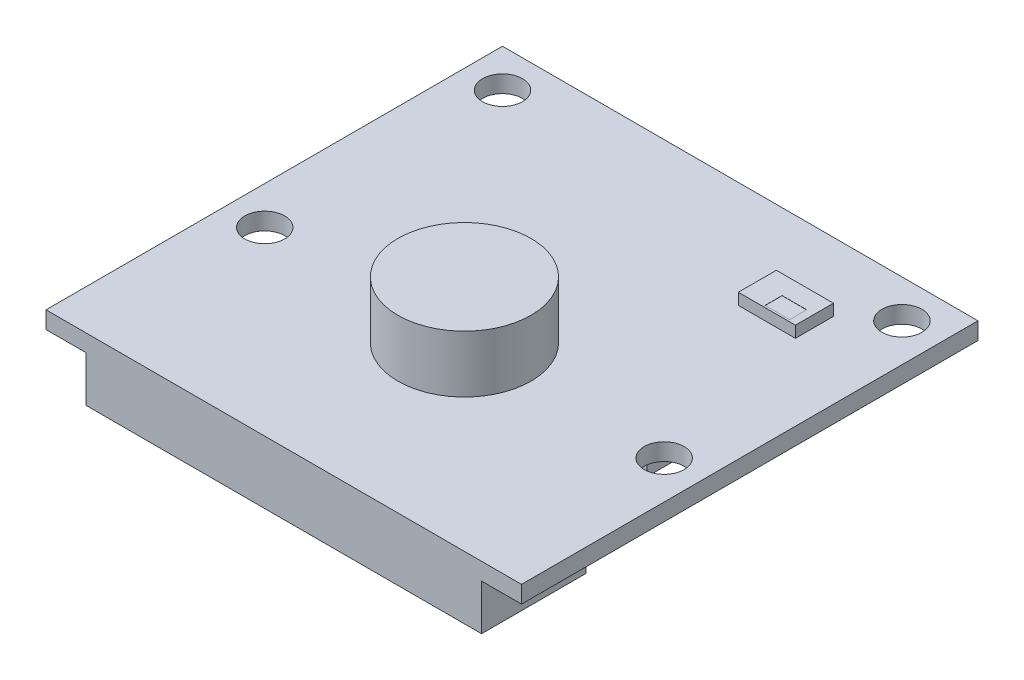
ISO-10303-21;
HEADER;
FILE_DESCRIPTION(('STEP AP214'),'2;1');
FILE_NAME('part.step','',(''),(''),'','','');
FILE_SCHEMA(('AUTOMOTIVE_DESIGN { 1 0 10303 214 1 1 1 1 }'));
ENDSEC;
DATA;
#1=APPLICATION_CONTEXT('core data for automotive mechanical design processes');
#2=APPLICATION_PROTOCOL_DEFINITION('international standard','automotive_design',2000,#1);
#3=PRODUCT_CONTEXT('',#1,'mechanical');
#4=PRODUCT('Part','Part','',(#3));
#5=PRODUCT_RELATED_PRODUCT_CATEGORY('part','',(#4));
#6=PRODUCT_DEFINITION_FORMATION('','',#4);
#7=PRODUCT_DEFINITION_CONTEXT('part definition',#1,'design');
#8=PRODUCT_DEFINITION('design','',#6,#7);
#9=PRODUCT_DEFINITION_SHAPE('','',#8);
#10=(LENGTH_UNIT() NAMED_UNIT(*) SI_UNIT(.MILLI.,.METRE.));
#11=(NAMED_UNIT(*) PLANE_ANGLE_UNIT() SI_UNIT($,.RADIAN.));
#12=(NAMED_UNIT(*) SI_UNIT($,.STERADIAN.) SOLID_ANGLE_UNIT());
#13=UNCERTAINTY_MEASURE_WITH_UNIT(LENGTH_MEASURE(1.E-05),#10,'distance_accuracy_value','');
#14=(GEOMETRIC_REPRESENTATION_CONTEXT(3) GLOBAL_UNCERTAINTY_ASSIGNED_CONTEXT((#13)) GLOBAL_UNIT_ASSIGNED_CONTEXT((#10,
#11,#12)) REPRESENTATION_CONTEXT('',''));
#15=CARTESIAN_POINT('',(0.,0.,0.));
#16=DIRECTION('',(0.,0.,1.));
#17=DIRECTION('',(1.,0.,0.));
#18=AXIS2_PLACEMENT_3D('',#15,#16,#17);
#19=CARTESIAN_POINT('',(0.,0.,0.));
#20=DIRECTION('',(0.,1.,0.));
#21=DIRECTION('',(0.,0.,1.));
#22=AXIS2_PLACEMENT_3D('',#19,#20,#21);
#23=PLANE('',#22);
#24=DIRECTION('',(1.,0.,0.));
#25=VECTOR('',#24,1.);
#26=CARTESIAN_POINT('',(5.5,0.,-8.90000000000001));
#27=LINE('',#26,#25);
#28=CARTESIAN_POINT('',(5.5,0.,-8.90000000000001));
#29=VERTEX_POINT('',#28);
#30=CARTESIAN_POINT('',(8.5,0.,-8.90000000000001));
#31=VERTEX_POINT('',#30);
#32=EDGE_CURVE('E227',#29,#31,#27,.T.);
#33=ORIENTED_EDGE('',*,*,#32,.F.);
#34=DIRECTION('',(0.,0.,1.));
#35=VECTOR('',#34,1.);
#36=CARTESIAN_POINT('',(5.5,0.,-10.9));
#37=LINE('',#36,#35);
#38=CARTESIAN_POINT('',(5.5,0.,-10.9));
#39=VERTEX_POINT('',#38);
#40=EDGE_CURVE('E210',#39,#29,#37,.T.);
#41=ORIENTED_EDGE('',*,*,#40,.F.);
#42=DIRECTION('',(-1.,0.,0.));
#43=VECTOR('',#42,1.);
#44=CARTESIAN_POINT('',(5.5,0.,-10.9));
#45=LINE('',#44,#43);
#46=CARTESIAN_POINT('',(8.5,0.,-10.9));
#47=VERTEX_POINT('',#46);
#48=EDGE_CURVE('E218',#47,#39,#45,.T.);
#49=ORIENTED_EDGE('',*,*,#48,.F.);
#50=DIRECTION('',(0.,0.,-1.));
#51=VECTOR('',#50,1.);
#52=CARTESIAN_POINT('',(8.5,0.,-10.9));
#53=LINE('',#52,#51);
#54=EDGE_CURVE('E229',#31,#47,#53,.T.);
#55=ORIENTED_EDGE('',*,*,#54,.F.);
#56=EDGE_LOOP('',(#33,#41,#49,#55));
#57=FACE_BOUND('',#56,.T.);
#58=CARTESIAN_POINT('',(-10.5,0.,-12.5));
#59=DIRECTION('',(0.,1.,0.));
#60=DIRECTION('',(0.,0.,-1.));
#61=AXIS2_PLACEMENT_3D('',#58,#59,#60);
#62=CIRCLE('',#61,1.05);
#63=CARTESIAN_POINT('',(-10.5,0.,-13.55));
#64=VERTEX_POINT('',#63);
#65=EDGE_CURVE('E377',#64,#64,#62,.T.);
#66=ORIENTED_EDGE('',*,*,#65,.F.);
#67=EDGE_LOOP('',(#66));
#68=FACE_BOUND('',#67,.T.);
#69=CARTESIAN_POINT('',(-10.5,0.,0.));
#70=DIRECTION('',(0.,1.,0.));
#71=DIRECTION('',(0.,0.,-1.));
#72=AXIS2_PLACEMENT_3D('',#69,#70,#71);
#73=CIRCLE('',#72,1.05);
#74=CARTESIAN_POINT('',(-10.5,0.,-1.05));
#75=VERTEX_POINT('',#74);
#76=EDGE_CURVE('E383',#75,#75,#73,.T.);
#77=ORIENTED_EDGE('',*,*,#76,.F.);
#78=EDGE_LOOP('',(#77));
#79=FACE_BOUND('',#78,.T.);
#80=CARTESIAN_POINT('',(10.5,0.,0.));
#81=DIRECTION('',(0.,1.,0.));
#82=DIRECTION('',(0.,0.,1.));
#83=AXIS2_PLACEMENT_3D('',#80,#81,#82);
#84=CIRCLE('',#83,1.05);
#85=CARTESIAN_POINT('',(10.5,0.,1.05));
#86=VERTEX_POINT('',#85);
#87=EDGE_CURVE('E388',#86,#86,#84,.T.);
#88=ORIENTED_EDGE('',*,*,#87,.F.);
#89=EDGE_LOOP('',(#88));
#90=FACE_BOUND('',#89,.T.);
#91=CARTESIAN_POINT('',(10.5,0.,-12.5));
#92=DIRECTION('',(0.,1.,0.));
#93=DIRECTION('',(0.,0.,1.));
#94=AXIS2_PLACEMENT_3D('',#91,#92,#93);
#95=CIRCLE('',#94,1.05);
#96=CARTESIAN_POINT('',(10.5,0.,-11.45));
#97=VERTEX_POINT('',#96);
#98=EDGE_CURVE('E394',#97,#97,#95,.T.);
#99=ORIENTED_EDGE('',*,*,#98,.F.);
#100=EDGE_LOOP('',(#99));
#101=FACE_BOUND('',#100,.T.);
#102=DIRECTION('',(0.,0.,1.));
#103=VECTOR('',#102,1.);
#104=CARTESIAN_POINT('',(-12.5,0.,-14.5));
#105=LINE('',#104,#103);
#106=CARTESIAN_POINT('',(-12.5,0.,-14.5));
#107=VERTEX_POINT('',#106);
#108=CARTESIAN_POINT('',(-12.5,0.,9.5));
#109=VERTEX_POINT('',#108);
#110=EDGE_CURVE('E331',#107,#109,#105,.T.);
#111=ORIENTED_EDGE('',*,*,#110,.T.);
#112=DIRECTION('',(1.,0.,0.));
#113=VECTOR('',#112,1.);
#114=CARTESIAN_POINT('',(-12.5,0.,9.5));
#115=LINE('',#114,#113);
#116=CARTESIAN_POINT('',(12.5,0.,9.5));
#117=VERTEX_POINT('',#116);
#118=EDGE_CURVE('E334',#109,#117,#115,.T.);
#119=ORIENTED_EDGE('',*,*,#118,.T.);
#120=DIRECTION('',(0.,0.,-1.));
#121=VECTOR('',#120,1.);
#122=CARTESIAN_POINT('',(12.5,0.,-14.5));
#123=LINE('',#122,#121);
#124=CARTESIAN_POINT('',(12.5,0.,-14.5));
#125=VERTEX_POINT('',#124);
#126=EDGE_CURVE('E338',#117,#125,#123,.T.);
#127=ORIENTED_EDGE('',*,*,#126,.T.);
#128=DIRECTION('',(-1.,0.,0.));
#129=VECTOR('',#128,1.);
#130=CARTESIAN_POINT('',(-12.5,0.,-14.5));
#131=LINE('',#130,#129);
#132=EDGE_CURVE('E341',#125,#107,#131,.T.);
#133=ORIENTED_EDGE('',*,*,#132,.T.);
#134=EDGE_LOOP('',(#111,#119,#127,#133));
#135=FACE_BOUND('',#134,.T.);
#136=CARTESIAN_POINT('',(0.,0.,0.));
#137=DIRECTION('',(0.,1.,0.));
#138=DIRECTION('',(0.,0.,1.));
#139=AXIS2_PLACEMENT_3D('',#136,#137,#138);
#140=CIRCLE('',#139,3.5);
#141=CARTESIAN_POINT('',(0.,0.,3.5));
#142=VERTEX_POINT('',#141);
#143=EDGE_CURVE('E197',#142,#142,#140,.T.);
#144=ORIENTED_EDGE('',*,*,#143,.F.);
#145=EDGE_LOOP('',(#144));
#146=FACE_BOUND('',#145,.T.);
#147=ADVANCED_FACE('F32',(#57,#68,#79,#90,#101,#135,#146),#23,.T.);
#148=CARTESIAN_POINT('',(0.,-0.9,0.));
#149=DIRECTION('',(0.,1.,0.));
#150=DIRECTION('',(0.,0.,1.));
#151=AXIS2_PLACEMENT_3D('',#148,#149,#150);
#152=PLANE('',#151);
#153=DIRECTION('',(0.,0.,-1.));
#154=VECTOR('',#153,1.);
#155=CARTESIAN_POINT('',(-10.4,-0.9,9.5));
#156=LINE('',#155,#154);
#157=CARTESIAN_POINT('',(-10.4,-0.9,9.5));
#158=VERTEX_POINT('',#157);
#159=CARTESIAN_POINT('',(-10.4,-0.9,4.));
#160=VERTEX_POINT('',#159);
#161=EDGE_CURVE('E273',#158,#160,#156,.T.);
#162=ORIENTED_EDGE('',*,*,#161,.F.);
#163=DIRECTION('',(1.,0.,0.));
#164=VECTOR('',#163,1.);
#165=CARTESIAN_POINT('',(-12.5,-0.9,9.5));
#166=LINE('',#165,#164);
#167=CARTESIAN_POINT('',(-12.5,-0.9,9.5));
#168=VERTEX_POINT('',#167);
#169=EDGE_CURVE('E316',#168,#158,#166,.T.);
#170=ORIENTED_EDGE('',*,*,#169,.F.);
#171=DIRECTION('',(0.,0.,1.));
#172=VECTOR('',#171,1.);
#173=CARTESIAN_POINT('',(-12.5,-0.9,-14.5));
#174=LINE('',#173,#172);
#175=CARTESIAN_POINT('',(-12.5,-0.9,-14.5));
#176=VERTEX_POINT('',#175);
#177=EDGE_CURVE('E317',#176,#168,#174,.T.);
#178=ORIENTED_EDGE('',*,*,#177,.F.);
#179=DIRECTION('',(-1.,0.,0.));
#180=VECTOR('',#179,1.);
#181=CARTESIAN_POINT('',(-12.5,-0.9,-14.5));
#182=LINE('',#181,#180);
#183=CARTESIAN_POINT('',(12.5,-0.9,-14.5));
#184=VERTEX_POINT('',#183);
#185=EDGE_CURVE('E327',#184,#176,#182,.T.);
#186=ORIENTED_EDGE('',*,*,#185,.F.);
#187=DIRECTION('',(0.,0.,-1.));
#188=VECTOR('',#187,1.);
#189=CARTESIAN_POINT('',(12.5,-0.9,-14.5));
#190=LINE('',#189,#188);
#191=CARTESIAN_POINT('',(12.5,-0.9,9.5));
#192=VERTEX_POINT('',#191);
#193=EDGE_CURVE('E323',#192,#184,#190,.T.);
#194=ORIENTED_EDGE('',*,*,#193,.F.);
#195=CARTESIAN_POINT('',(10.4,-0.9,9.5));
#196=VERTEX_POINT('',#195);
#197=EDGE_CURVE('E313',#196,#192,#166,.T.);
#198=ORIENTED_EDGE('',*,*,#197,.F.);
#199=DIRECTION('',(0.,0.,1.));
#200=VECTOR('',#199,1.);
#201=CARTESIAN_POINT('',(10.4,-0.9,9.5));
#202=LINE('',#201,#200);
#203=CARTESIAN_POINT('',(10.4,-0.9,4.));
#204=VERTEX_POINT('',#203);
#205=EDGE_CURVE('E278',#204,#196,#202,.T.);
#206=ORIENTED_EDGE('',*,*,#205,.F.);
#207=DIRECTION('',(1.,0.,0.));
#208=VECTOR('',#207,1.);
#209=CARTESIAN_POINT('',(-10.4,-0.9,4.));
#210=LINE('',#209,#208);
#211=EDGE_CURVE('E285',#160,#204,#210,.T.);
#212=ORIENTED_EDGE('',*,*,#211,.F.);
#213=EDGE_LOOP('',(#162,#170,#178,#186,#194,#198,#206,#212));
#214=FACE_BOUND('',#213,.T.);
#215=CARTESIAN_POINT('',(-10.5,-0.9,-12.5));
#216=DIRECTION('',(0.,1.,0.));
#217=DIRECTION('',(0.,0.,-1.));
#218=AXIS2_PLACEMENT_3D('',#215,#216,#217);
#219=CIRCLE('',#218,1.05);
#220=CARTESIAN_POINT('',(-10.5,-0.9,-13.55));
#221=VERTEX_POINT('',#220);
#222=EDGE_CURVE('E379',#221,#221,#219,.T.);
#223=ORIENTED_EDGE('',*,*,#222,.T.);
#224=EDGE_LOOP('',(#223));
#225=FACE_BOUND('',#224,.T.);
#226=CARTESIAN_POINT('',(-10.5,-0.9,0.));
#227=DIRECTION('',(0.,1.,0.));
#228=DIRECTION('',(0.,0.,-1.));
#229=AXIS2_PLACEMENT_3D('',#226,#227,#228);
#230=CIRCLE('',#229,1.05);
#231=CARTESIAN_POINT('',(-10.5,-0.9,-1.05));
#232=VERTEX_POINT('',#231);
#233=EDGE_CURVE('E385',#232,#232,#230,.T.);
#234=ORIENTED_EDGE('',*,*,#233,.T.);
#235=EDGE_LOOP('',(#234));
#236=FACE_BOUND('',#235,.T.);
#237=CARTESIAN_POINT('',(10.5,-0.9,0.));
#238=DIRECTION('',(0.,1.,0.));
#239=DIRECTION('',(0.,0.,1.));
#240=AXIS2_PLACEMENT_3D('',#237,#238,#239);
#241=CIRCLE('',#240,1.05);
#242=CARTESIAN_POINT('',(10.5,-0.9,1.05));
#243=VERTEX_POINT('',#242);
#244=EDGE_CURVE('E391',#243,#243,#241,.T.);
#245=ORIENTED_EDGE('',*,*,#244,.T.);
#246=EDGE_LOOP('',(#245));
#247=FACE_BOUND('',#246,.T.);
#248=CARTESIAN_POINT('',(10.5,-0.9,-12.5));
#249=DIRECTION('',(0.,1.,0.));
#250=DIRECTION('',(0.,0.,1.));
#251=AXIS2_PLACEMENT_3D('',#248,#249,#250);
#252=CIRCLE('',#251,1.05);
#253=CARTESIAN_POINT('',(10.5,-0.9,-11.45));
#254=VERTEX_POINT('',#253);
#255=EDGE_CURVE('E335',#254,#254,#252,.T.);
#256=ORIENTED_EDGE('',*,*,#255,.T.);
#257=EDGE_LOOP('',(#256));
#258=FACE_BOUND('',#257,.T.);
#259=DIRECTION('',(0.,0.,-1.));
#260=VECTOR('',#259,1.);
#261=CARTESIAN_POINT('',(-9.,-0.9,-0.900000000000005));
#262=LINE('',#261,#260);
#263=CARTESIAN_POINT('',(-9.,-0.9,-0.900000000000005));
#264=VERTEX_POINT('',#263);
#265=CARTESIAN_POINT('',(-9.,-0.9,-12.5));
#266=VERTEX_POINT('',#265);
#267=EDGE_CURVE('E240',#264,#266,#262,.T.);
#268=ORIENTED_EDGE('',*,*,#267,.F.);
#269=DIRECTION('',(-1.,0.,0.));
#270=VECTOR('',#269,1.);
#271=CARTESIAN_POINT('',(-9.,-0.9,-0.900000000000005));
#272=LINE('',#271,#270);
#273=CARTESIAN_POINT('',(8.7,-0.9,-0.900000000000005));
#274=VERTEX_POINT('',#273);
#275=EDGE_CURVE('E245',#274,#264,#272,.T.);
#276=ORIENTED_EDGE('',*,*,#275,.F.);
#277=DIRECTION('',(0.,0.,1.));
#278=VECTOR('',#277,1.);
#279=CARTESIAN_POINT('',(8.7,-0.9,-0.900000000000005));
#280=LINE('',#279,#278);
#281=CARTESIAN_POINT('',(8.7,-0.9,-12.5));
#282=VERTEX_POINT('',#281);
#283=EDGE_CURVE('E257',#282,#274,#280,.T.);
#284=ORIENTED_EDGE('',*,*,#283,.F.);
#285=DIRECTION('',(1.,0.,0.));
#286=VECTOR('',#285,1.);
#287=CARTESIAN_POINT('',(-9.,-0.9,-12.5));
#288=LINE('',#287,#286);
#289=EDGE_CURVE('E254',#266,#282,#288,.T.);
#290=ORIENTED_EDGE('',*,*,#289,.F.);
#291=EDGE_LOOP('',(#268,#276,#284,#290));
#292=FACE_BOUND('',#291,.T.);
#293=ADVANCED_FACE('F363',(#214,#225,#236,#247,#258,#292),#152,.F.);
#294=CARTESIAN_POINT('',(-12.5,-0.9,-14.5));
#295=DIRECTION('',(-1.,0.,0.));
#296=DIRECTION('',(0.,0.,1.));
#297=AXIS2_PLACEMENT_3D('',#294,#295,#296);
#298=PLANE('',#297);
#299=ORIENTED_EDGE('',*,*,#110,.F.);
#300=DIRECTION('',(0.,1.,0.));
#301=VECTOR('',#300,1.);
#302=CARTESIAN_POINT('',(-12.5,-0.9,-14.5));
#303=LINE('',#302,#301);
#304=EDGE_CURVE('E11',#176,#107,#303,.T.);
#305=ORIENTED_EDGE('',*,*,#304,.F.);
#306=ORIENTED_EDGE('',*,*,#177,.T.);
#307=DIRECTION('',(0.,1.,0.));
#308=VECTOR('',#307,1.);
#309=CARTESIAN_POINT('',(-12.5,-0.9,9.5));
#310=LINE('',#309,#308);
#311=EDGE_CURVE('E330',#168,#109,#310,.T.);
#312=ORIENTED_EDGE('',*,*,#311,.T.);
#313=EDGE_LOOP('',(#299,#305,#306,#312));
#314=FACE_BOUND('',#313,.T.);
#315=ADVANCED_FACE('F34',(#314),#298,.T.);
#316=CARTESIAN_POINT('',(-12.5,-0.9,-14.5));
#317=DIRECTION('',(0.,0.,-1.));
#318=DIRECTION('',(-1.,0.,0.));
#319=AXIS2_PLACEMENT_3D('',#316,#317,#318);
#320=PLANE('',#319);
#321=ORIENTED_EDGE('',*,*,#132,.F.);
#322=DIRECTION('',(0.,1.,0.));
#323=VECTOR('',#322,1.);
#324=CARTESIAN_POINT('',(12.5,-0.9,-14.5));
#325=LINE('',#324,#323);
#326=EDGE_CURVE('E41',#184,#125,#325,.T.);
#327=ORIENTED_EDGE('',*,*,#326,.F.);
#328=ORIENTED_EDGE('',*,*,#185,.T.);
#329=ORIENTED_EDGE('',*,*,#304,.T.);
#330=EDGE_LOOP('',(#321,#327,#328,#329));
#331=FACE_BOUND('',#330,.T.);
#332=ADVANCED_FACE('F360',(#331),#320,.T.);
#333=CARTESIAN_POINT('',(12.5,-0.9,-14.5));
#334=DIRECTION('',(1.,0.,0.));
#335=DIRECTION('',(0.,0.,-1.));
#336=AXIS2_PLACEMENT_3D('',#333,#334,#335);
#337=PLANE('',#336);
#338=ORIENTED_EDGE('',*,*,#126,.F.);
#339=DIRECTION('',(0.,1.,0.));
#340=VECTOR('',#339,1.);
#341=CARTESIAN_POINT('',(12.5,-0.9,9.5));
#342=LINE('',#341,#340);
#343=EDGE_CURVE('E345',#192,#117,#342,.T.);
#344=ORIENTED_EDGE('',*,*,#343,.F.);
#345=ORIENTED_EDGE('',*,*,#193,.T.);
#346=ORIENTED_EDGE('',*,*,#326,.T.);
#347=EDGE_LOOP('',(#338,#344,#345,#346));
#348=FACE_BOUND('',#347,.T.);
#349=ADVANCED_FACE('F416',(#348),#337,.T.);
#350=CARTESIAN_POINT('',(-12.5,-0.9,9.5));
#351=DIRECTION('',(0.,0.,1.));
#352=DIRECTION('',(1.,0.,0.));
#353=AXIS2_PLACEMENT_3D('',#350,#351,#352);
#354=PLANE('',#353);
#355=ORIENTED_EDGE('',*,*,#118,.F.);
#356=ORIENTED_EDGE('',*,*,#311,.F.);
#357=ORIENTED_EDGE('',*,*,#169,.T.);
#358=DIRECTION('',(0.,1.,0.));
#359=VECTOR('',#358,1.);
#360=CARTESIAN_POINT('',(-10.4,-3.3,9.5));
#361=LINE('',#360,#359);
#362=CARTESIAN_POINT('',(-10.4,-3.3,9.5));
#363=VERTEX_POINT('',#362);
#364=EDGE_CURVE('E284',#363,#158,#361,.T.);
#365=ORIENTED_EDGE('',*,*,#364,.F.);
#366=DIRECTION('',(-1.,0.,0.));
#367=VECTOR('',#366,1.);
#368=CARTESIAN_POINT('',(-10.4,-3.3,9.5));
#369=LINE('',#368,#367);
#370=CARTESIAN_POINT('',(10.4,-3.3,9.5));
#371=VERTEX_POINT('',#370);
#372=EDGE_CURVE('E282',#371,#363,#369,.T.);
#373=ORIENTED_EDGE('',*,*,#372,.F.);
#374=DIRECTION('',(0.,1.,0.));
#375=VECTOR('',#374,1.);
#376=CARTESIAN_POINT('',(10.4,-3.3,9.5));
#377=LINE('',#376,#375);
#378=EDGE_CURVE('E297',#371,#196,#377,.T.);
#379=ORIENTED_EDGE('',*,*,#378,.T.);
#380=ORIENTED_EDGE('',*,*,#197,.T.);
#381=ORIENTED_EDGE('',*,*,#343,.T.);
#382=EDGE_LOOP('',(#355,#356,#357,#365,#373,#379,#380,#381));
#383=FACE_BOUND('',#382,.T.);
#384=ADVANCED_FACE('F353',(#383),#354,.T.);
#385=CARTESIAN_POINT('',(10.5,-0.9,-12.5));
#386=DIRECTION('',(0.,1.,0.));
#387=DIRECTION('',(0.,0.,1.));
#388=AXIS2_PLACEMENT_3D('',#385,#386,#387);
#389=CYLINDRICAL_SURFACE('',#388,1.05);
#390=ORIENTED_EDGE('',*,*,#255,.F.);
#391=EDGE_LOOP('',(#390));
#392=FACE_BOUND('',#391,.T.);
#393=ORIENTED_EDGE('',*,*,#98,.T.);
#394=EDGE_LOOP('',(#393));
#395=FACE_BOUND('',#394,.T.);
#396=ADVANCED_FACE('F401',(#392,#395),#389,.F.);
#397=CARTESIAN_POINT('',(10.5,-0.9,0.));
#398=DIRECTION('',(0.,1.,0.));
#399=DIRECTION('',(0.,0.,1.));
#400=AXIS2_PLACEMENT_3D('',#397,#398,#399);
#401=CYLINDRICAL_SURFACE('',#400,1.05);
#402=ORIENTED_EDGE('',*,*,#244,.F.);
#403=EDGE_LOOP('',(#402));
#404=FACE_BOUND('',#403,.T.);
#405=ORIENTED_EDGE('',*,*,#87,.T.);
#406=EDGE_LOOP('',(#405));
#407=FACE_BOUND('',#406,.T.);
#408=ADVANCED_FACE('F423',(#404,#407),#401,.F.);
#409=CARTESIAN_POINT('',(-10.5,-0.9,0.));
#410=DIRECTION('',(0.,1.,0.));
#411=DIRECTION('',(0.,0.,1.));
#412=AXIS2_PLACEMENT_3D('',#409,#410,#411);
#413=CYLINDRICAL_SURFACE('',#412,1.05);
#414=ORIENTED_EDGE('',*,*,#233,.F.);
#415=EDGE_LOOP('',(#414));
#416=FACE_BOUND('',#415,.T.);
#417=ORIENTED_EDGE('',*,*,#76,.T.);
#418=EDGE_LOOP('',(#417));
#419=FACE_BOUND('',#418,.T.);
#420=ADVANCED_FACE('F428',(#416,#419),#413,.F.);
#421=CARTESIAN_POINT('',(-10.5,-0.9,-12.5));
#422=DIRECTION('',(0.,1.,0.));
#423=DIRECTION('',(0.,0.,1.));
#424=AXIS2_PLACEMENT_3D('',#421,#422,#423);
#425=CYLINDRICAL_SURFACE('',#424,1.05);
#426=ORIENTED_EDGE('',*,*,#222,.F.);
#427=EDGE_LOOP('',(#426));
#428=FACE_BOUND('',#427,.T.);
#429=ORIENTED_EDGE('',*,*,#65,.T.);
#430=EDGE_LOOP('',(#429));
#431=FACE_BOUND('',#430,.T.);
#432=ADVANCED_FACE('F435',(#428,#431),#425,.F.);
#433=CARTESIAN_POINT('',(-10.4,-3.3,9.5));
#434=DIRECTION('',(1.,0.,0.));
#435=DIRECTION('',(0.,0.,-1.));
#436=AXIS2_PLACEMENT_3D('',#433,#434,#435);
#437=PLANE('',#436);
#438=ORIENTED_EDGE('',*,*,#161,.T.);
#439=DIRECTION('',(0.,1.,0.));
#440=VECTOR('',#439,1.);
#441=CARTESIAN_POINT('',(-10.4,-3.3,4.));
#442=LINE('',#441,#440);
#443=CARTESIAN_POINT('',(-10.4,-3.3,4.));
#444=VERTEX_POINT('',#443);
#445=EDGE_CURVE('E303',#444,#160,#442,.T.);
#446=ORIENTED_EDGE('',*,*,#445,.F.);
#447=DIRECTION('',(0.,0.,-1.));
#448=VECTOR('',#447,1.);
#449=CARTESIAN_POINT('',(-10.4,-3.3,9.5));
#450=LINE('',#449,#448);
#451=EDGE_CURVE('E274',#363,#444,#450,.T.);
#452=ORIENTED_EDGE('',*,*,#451,.F.);
#453=ORIENTED_EDGE('',*,*,#364,.T.);
#454=EDGE_LOOP('',(#438,#446,#452,#453));
#455=FACE_BOUND('',#454,.T.);
#456=ADVANCED_FACE('F367',(#455),#437,.F.);
#457=CARTESIAN_POINT('',(-10.4,-3.3,4.));
#458=DIRECTION('',(0.,0.,1.));
#459=DIRECTION('',(1.,0.,0.));
#460=AXIS2_PLACEMENT_3D('',#457,#458,#459);
#461=PLANE('',#460);
#462=ORIENTED_EDGE('',*,*,#211,.T.);
#463=DIRECTION('',(0.,1.,0.));
#464=VECTOR('',#463,1.);
#465=CARTESIAN_POINT('',(10.4,-3.3,4.));
#466=LINE('',#465,#464);
#467=CARTESIAN_POINT('',(10.4,-3.3,4.));
#468=VERTEX_POINT('',#467);
#469=EDGE_CURVE('E290',#468,#204,#466,.T.);
#470=ORIENTED_EDGE('',*,*,#469,.F.);
#471=DIRECTION('',(1.,0.,0.));
#472=VECTOR('',#471,1.);
#473=CARTESIAN_POINT('',(-10.4,-3.3,4.));
#474=LINE('',#473,#472);
#475=EDGE_CURVE('E277',#444,#468,#474,.T.);
#476=ORIENTED_EDGE('',*,*,#475,.F.);
#477=ORIENTED_EDGE('',*,*,#445,.T.);
#478=EDGE_LOOP('',(#462,#470,#476,#477));
#479=FACE_BOUND('',#478,.T.);
#480=ADVANCED_FACE('F376',(#479),#461,.F.);
#481=CARTESIAN_POINT('',(10.4,-3.3,9.5));
#482=DIRECTION('',(-1.,0.,0.));
#483=DIRECTION('',(0.,0.,1.));
#484=AXIS2_PLACEMENT_3D('',#481,#482,#483);
#485=PLANE('',#484);
#486=ORIENTED_EDGE('',*,*,#205,.T.);
#487=ORIENTED_EDGE('',*,*,#378,.F.);
#488=DIRECTION('',(0.,0.,1.));
#489=VECTOR('',#488,1.);
#490=CARTESIAN_POINT('',(10.4,-3.3,9.5));
#491=LINE('',#490,#489);
#492=EDGE_CURVE('E280',#468,#371,#491,.T.);
#493=ORIENTED_EDGE('',*,*,#492,.F.);
#494=ORIENTED_EDGE('',*,*,#469,.T.);
#495=EDGE_LOOP('',(#486,#487,#493,#494));
#496=FACE_BOUND('',#495,.T.);
#497=ADVANCED_FACE('F374',(#496),#485,.F.);
#498=CARTESIAN_POINT('',(0.,-3.3,0.));
#499=DIRECTION('',(0.,-1.,0.));
#500=DIRECTION('',(0.,0.,-1.));
#501=AXIS2_PLACEMENT_3D('',#498,#499,#500);
#502=PLANE('',#501);
#503=ORIENTED_EDGE('',*,*,#451,.T.);
#504=ORIENTED_EDGE('',*,*,#475,.T.);
#505=ORIENTED_EDGE('',*,*,#492,.T.);
#506=ORIENTED_EDGE('',*,*,#372,.T.);
#507=EDGE_LOOP('',(#503,#504,#505,#506));
#508=FACE_BOUND('',#507,.T.);
#509=ADVANCED_FACE('F370',(#508),#502,.T.);
#510=CARTESIAN_POINT('',(-9.,-2.2,-0.900000000000005));
#511=DIRECTION('',(1.,0.,0.));
#512=DIRECTION('',(0.,0.,-1.));
#513=AXIS2_PLACEMENT_3D('',#510,#511,#512);
#514=PLANE('',#513);
#515=ORIENTED_EDGE('',*,*,#267,.T.);
#516=DIRECTION('',(0.,1.,0.));
#517=VECTOR('',#516,1.);
#518=CARTESIAN_POINT('',(-9.,-2.2,-12.5));
#519=LINE('',#518,#517);
#520=CARTESIAN_POINT('',(-9.,-2.2,-12.5));
#521=VERTEX_POINT('',#520);
#522=EDGE_CURVE('E270',#521,#266,#519,.T.);
#523=ORIENTED_EDGE('',*,*,#522,.F.);
#524=DIRECTION('',(0.,0.,-1.));
#525=VECTOR('',#524,1.);
#526=CARTESIAN_POINT('',(-9.,-2.2,-0.900000000000005));
#527=LINE('',#526,#525);
#528=CARTESIAN_POINT('',(-9.,-2.2,-0.900000000000005));
#529=VERTEX_POINT('',#528);
#530=EDGE_CURVE('E241',#529,#521,#527,.T.);
#531=ORIENTED_EDGE('',*,*,#530,.F.);
#532=DIRECTION('',(0.,1.,0.));
#533=VECTOR('',#532,1.);
#534=CARTESIAN_POINT('',(-9.,-2.2,-0.900000000000005));
#535=LINE('',#534,#533);
#536=EDGE_CURVE('E251',#529,#264,#535,.T.);
#537=ORIENTED_EDGE('',*,*,#536,.T.);
#538=EDGE_LOOP('',(#515,#523,#531,#537));
#539=FACE_BOUND('',#538,.T.);
#540=ADVANCED_FACE('F448',(#539),#514,.F.);
#541=CARTESIAN_POINT('',(-9.,-2.2,-12.5));
#542=DIRECTION('',(0.,0.,1.));
#543=DIRECTION('',(1.,0.,0.));
#544=AXIS2_PLACEMENT_3D('',#541,#542,#543);
#545=PLANE('',#544);
#546=ORIENTED_EDGE('',*,*,#289,.T.);
#547=DIRECTION('',(0.,1.,0.));
#548=VECTOR('',#547,1.);
#549=CARTESIAN_POINT('',(8.7,-2.2,-12.5));
#550=LINE('',#549,#548);
#551=CARTESIAN_POINT('',(8.7,-2.2,-12.5));
#552=VERTEX_POINT('',#551);
#553=EDGE_CURVE('E267',#552,#282,#550,.T.);
#554=ORIENTED_EDGE('',*,*,#553,.F.);
#555=DIRECTION('',(1.,0.,0.));
#556=VECTOR('',#555,1.);
#557=CARTESIAN_POINT('',(-9.,-2.2,-12.5));
#558=LINE('',#557,#556);
#559=EDGE_CURVE('E244',#521,#552,#558,.T.);
#560=ORIENTED_EDGE('',*,*,#559,.F.);
#561=ORIENTED_EDGE('',*,*,#522,.T.);
#562=EDGE_LOOP('',(#546,#554,#560,#561));
#563=FACE_BOUND('',#562,.T.);
#564=ADVANCED_FACE('F451',(#563),#545,.F.);
#565=CARTESIAN_POINT('',(8.7,-2.2,-0.900000000000005));
#566=DIRECTION('',(-1.,0.,0.));
#567=DIRECTION('',(0.,0.,1.));
#568=AXIS2_PLACEMENT_3D('',#565,#566,#567);
#569=PLANE('',#568);
#570=ORIENTED_EDGE('',*,*,#283,.T.);
#571=DIRECTION('',(0.,1.,0.));
#572=VECTOR('',#571,1.);
#573=CARTESIAN_POINT('',(8.7,-2.2,-0.900000000000005));
#574=LINE('',#573,#572);
#575=CARTESIAN_POINT('',(8.7,-2.2,-0.900000000000005));
#576=VERTEX_POINT('',#575);
#577=EDGE_CURVE('E264',#576,#274,#574,.T.);
#578=ORIENTED_EDGE('',*,*,#577,.F.);
#579=DIRECTION('',(0.,0.,1.));
#580=VECTOR('',#579,1.);
#581=CARTESIAN_POINT('',(8.7,-2.2,-0.900000000000005));
#582=LINE('',#581,#580);
#583=EDGE_CURVE('E247',#552,#576,#582,.T.);
#584=ORIENTED_EDGE('',*,*,#583,.F.);
#585=ORIENTED_EDGE('',*,*,#553,.T.);
#586=EDGE_LOOP('',(#570,#578,#584,#585));
#587=FACE_BOUND('',#586,.T.);
#588=ADVANCED_FACE('F455',(#587),#569,.F.);
#589=CARTESIAN_POINT('',(-9.,-2.2,-0.900000000000005));
#590=DIRECTION('',(0.,0.,-1.));
#591=DIRECTION('',(-1.,0.,0.));
#592=AXIS2_PLACEMENT_3D('',#589,#590,#591);
#593=PLANE('',#592);
#594=ORIENTED_EDGE('',*,*,#275,.T.);
#595=ORIENTED_EDGE('',*,*,#536,.F.);
#596=DIRECTION('',(-1.,0.,0.));
#597=VECTOR('',#596,1.);
#598=CARTESIAN_POINT('',(-9.,-2.2,-0.900000000000005));
#599=LINE('',#598,#597);
#600=EDGE_CURVE('E249',#576,#529,#599,.T.);
#601=ORIENTED_EDGE('',*,*,#600,.F.);
#602=ORIENTED_EDGE('',*,*,#577,.T.);
#603=EDGE_LOOP('',(#594,#595,#601,#602));
#604=FACE_BOUND('',#603,.T.);
#605=ADVANCED_FACE('F459',(#604),#593,.F.);
#606=CARTESIAN_POINT('',(0.,-2.2,0.));
#607=DIRECTION('',(0.,-1.,0.));
#608=DIRECTION('',(0.,0.,-1.));
#609=AXIS2_PLACEMENT_3D('',#606,#607,#608);
#610=PLANE('',#609);
#611=ORIENTED_EDGE('',*,*,#530,.T.);
#612=ORIENTED_EDGE('',*,*,#559,.T.);
#613=ORIENTED_EDGE('',*,*,#583,.T.);
#614=ORIENTED_EDGE('',*,*,#600,.T.);
#615=EDGE_LOOP('',(#611,#612,#613,#614));
#616=FACE_BOUND('',#615,.T.);
#617=ADVANCED_FACE('F463',(#616),#610,.T.);
#618=CARTESIAN_POINT('',(5.5,0.6,-10.9));
#619=DIRECTION('',(1.,0.,0.));
#620=DIRECTION('',(0.,0.,-1.));
#621=AXIS2_PLACEMENT_3D('',#618,#619,#620);
#622=PLANE('',#621);
#623=ORIENTED_EDGE('',*,*,#40,.T.);
#624=DIRECTION('',(0.,-1.,0.));
#625=VECTOR('',#624,1.);
#626=CARTESIAN_POINT('',(5.5,0.6,-8.90000000000001));
#627=LINE('',#626,#625);
#628=CARTESIAN_POINT('',(5.5,0.6,-8.90000000000001));
#629=VERTEX_POINT('',#628);
#630=EDGE_CURVE('E238',#629,#29,#627,.T.);
#631=ORIENTED_EDGE('',*,*,#630,.F.);
#632=DIRECTION('',(0.,0.,1.));
#633=VECTOR('',#632,1.);
#634=CARTESIAN_POINT('',(5.5,0.6,-10.9));
#635=LINE('',#634,#633);
#636=CARTESIAN_POINT('',(5.5,0.6,-10.9));
#637=VERTEX_POINT('',#636);
#638=EDGE_CURVE('E214',#637,#629,#635,.T.);
#639=ORIENTED_EDGE('',*,*,#638,.F.);
#640=DIRECTION('',(0.,-1.,0.));
#641=VECTOR('',#640,1.);
#642=CARTESIAN_POINT('',(5.5,0.6,-10.9));
#643=LINE('',#642,#641);
#644=EDGE_CURVE('E224',#637,#39,#643,.T.);
#645=ORIENTED_EDGE('',*,*,#644,.T.);
#646=EDGE_LOOP('',(#623,#631,#639,#645));
#647=FACE_BOUND('',#646,.T.);
#648=ADVANCED_FACE('F467',(#647),#622,.F.);
#649=CARTESIAN_POINT('',(5.5,0.6,-8.90000000000001));
#650=DIRECTION('',(0.,0.,-1.));
#651=DIRECTION('',(-1.,0.,0.));
#652=AXIS2_PLACEMENT_3D('',#649,#650,#651);
#653=PLANE('',#652);
#654=ORIENTED_EDGE('',*,*,#32,.T.);
#655=DIRECTION('',(0.,-1.,0.));
#656=VECTOR('',#655,1.);
#657=CARTESIAN_POINT('',(8.5,0.6,-8.90000000000001));
#658=LINE('',#657,#656);
#659=CARTESIAN_POINT('',(8.5,0.6,-8.90000000000001));
#660=VERTEX_POINT('',#659);
#661=EDGE_CURVE('E235',#660,#31,#658,.T.);
#662=ORIENTED_EDGE('',*,*,#661,.F.);
#663=DIRECTION('',(1.,0.,0.));
#664=VECTOR('',#663,1.);
#665=CARTESIAN_POINT('',(5.5,0.6,-8.90000000000001));
#666=LINE('',#665,#664);
#667=EDGE_CURVE('E217',#629,#660,#666,.T.);
#668=ORIENTED_EDGE('',*,*,#667,.F.);
#669=ORIENTED_EDGE('',*,*,#630,.T.);
#670=EDGE_LOOP('',(#654,#662,#668,#669));
#671=FACE_BOUND('',#670,.T.);
#672=ADVANCED_FACE('F471',(#671),#653,.F.);
#673=CARTESIAN_POINT('',(8.5,0.6,-10.9));
#674=DIRECTION('',(-1.,0.,0.));
#675=DIRECTION('',(0.,0.,1.));
#676=AXIS2_PLACEMENT_3D('',#673,#674,#675);
#677=PLANE('',#676);
#678=ORIENTED_EDGE('',*,*,#54,.T.);
#679=DIRECTION('',(0.,-1.,0.));
#680=VECTOR('',#679,1.);
#681=CARTESIAN_POINT('',(8.5,0.6,-10.9));
#682=LINE('',#681,#680);
#683=CARTESIAN_POINT('',(8.5,0.6,-10.9));
#684=VERTEX_POINT('',#683);
#685=EDGE_CURVE('E57',#684,#47,#682,.T.);
#686=ORIENTED_EDGE('',*,*,#685,.F.);
#687=DIRECTION('',(0.,0.,-1.));
#688=VECTOR('',#687,1.);
#689=CARTESIAN_POINT('',(8.5,0.6,-10.9));
#690=LINE('',#689,#688);
#691=EDGE_CURVE('E220',#660,#684,#690,.T.);
#692=ORIENTED_EDGE('',*,*,#691,.F.);
#693=ORIENTED_EDGE('',*,*,#661,.T.);
#694=EDGE_LOOP('',(#678,#686,#692,#693));
#695=FACE_BOUND('',#694,.T.);
#696=ADVANCED_FACE('F475',(#695),#677,.F.);
#697=CARTESIAN_POINT('',(5.5,0.6,-10.9));
#698=DIRECTION('',(0.,0.,1.));
#699=DIRECTION('',(1.,0.,0.));
#700=AXIS2_PLACEMENT_3D('',#697,#698,#699);
#701=PLANE('',#700);
#702=ORIENTED_EDGE('',*,*,#48,.T.);
#703=ORIENTED_EDGE('',*,*,#644,.F.);
#704=DIRECTION('',(-1.,0.,0.));
#705=VECTOR('',#704,1.);
#706=CARTESIAN_POINT('',(5.5,0.6,-10.9));
#707=LINE('',#706,#705);
#708=EDGE_CURVE('E222',#684,#637,#707,.T.);
#709=ORIENTED_EDGE('',*,*,#708,.F.);
#710=ORIENTED_EDGE('',*,*,#685,.T.);
#711=EDGE_LOOP('',(#702,#703,#709,#710));
#712=FACE_BOUND('',#711,.T.);
#713=ADVANCED_FACE('F479',(#712),#701,.F.);
#714=CARTESIAN_POINT('',(0.,0.6,0.));
#715=DIRECTION('',(0.,1.,0.));
#716=DIRECTION('',(0.,0.,1.));
#717=AXIS2_PLACEMENT_3D('',#714,#715,#716);
#718=PLANE('',#717);
#719=DIRECTION('',(0.,0.,-1.));
#720=VECTOR('',#719,1.);
#721=CARTESIAN_POINT('',(8.1,0.6,-9.00000000000001));
#722=LINE('',#721,#720);
#723=CARTESIAN_POINT('',(8.1,0.6,-9.00000000000001));
#724=VERTEX_POINT('',#723);
#725=CARTESIAN_POINT('',(8.1,0.6,-9.9));
#726=VERTEX_POINT('',#725);
#727=EDGE_CURVE('E49',#724,#726,#722,.T.);
#728=ORIENTED_EDGE('',*,*,#727,.F.);
#729=DIRECTION('',(1.,0.,0.));
#730=VECTOR('',#729,1.);
#731=CARTESIAN_POINT('',(8.1,0.6,-9.00000000000001));
#732=LINE('',#731,#730);
#733=CARTESIAN_POINT('',(6.8,0.6,-9.00000000000001));
#734=VERTEX_POINT('',#733);
#735=EDGE_CURVE('E191',#734,#724,#732,.T.);
#736=ORIENTED_EDGE('',*,*,#735,.F.);
#737=DIRECTION('',(0.,0.,1.));
#738=VECTOR('',#737,1.);
#739=CARTESIAN_POINT('',(6.8,0.6,-9.00000000000001));
#740=LINE('',#739,#738);
#741=CARTESIAN_POINT('',(6.8,0.6,-9.9));
#742=VERTEX_POINT('',#741);
#743=EDGE_CURVE('E194',#742,#734,#740,.T.);
#744=ORIENTED_EDGE('',*,*,#743,.F.);
#745=DIRECTION('',(-1.,0.,0.));
#746=VECTOR('',#745,1.);
#747=CARTESIAN_POINT('',(8.1,0.6,-9.9));
#748=LINE('',#747,#746);
#749=EDGE_CURVE('E203',#726,#742,#748,.T.);
#750=ORIENTED_EDGE('',*,*,#749,.F.);
#751=EDGE_LOOP('',(#728,#736,#744,#750));
#752=FACE_BOUND('',#751,.T.);
#753=ORIENTED_EDGE('',*,*,#638,.T.);
#754=ORIENTED_EDGE('',*,*,#667,.T.);
#755=ORIENTED_EDGE('',*,*,#691,.T.);
#756=ORIENTED_EDGE('',*,*,#708,.T.);
#757=EDGE_LOOP('',(#753,#754,#755,#756));
#758=FACE_BOUND('',#757,.T.);
#759=ADVANCED_FACE('F483',(#752,#758),#718,.T.);
#760=CARTESIAN_POINT('',(8.1,0.59,-9.00000000000001));
#761=DIRECTION('',(1.,0.,0.));
#762=DIRECTION('',(0.,0.,-1.));
#763=AXIS2_PLACEMENT_3D('',#760,#761,#762);
#764=PLANE('',#763);
#765=ORIENTED_EDGE('',*,*,#727,.T.);
#766=DIRECTION('',(0.,1.,0.));
#767=VECTOR('',#766,1.);
#768=CARTESIAN_POINT('',(8.1,0.59,-9.9));
#769=LINE('',#768,#767);
#770=CARTESIAN_POINT('',(8.1,0.59,-9.9));
#771=VERTEX_POINT('',#770);
#772=EDGE_CURVE('E169',#771,#726,#769,.T.);
#773=ORIENTED_EDGE('',*,*,#772,.F.);
#774=DIRECTION('',(0.,0.,-1.));
#775=VECTOR('',#774,1.);
#776=CARTESIAN_POINT('',(8.1,0.59,-9.00000000000001));
#777=LINE('',#776,#775);
#778=CARTESIAN_POINT('',(8.1,0.59,-9.00000000000001));
#779=VERTEX_POINT('',#778);
#780=EDGE_CURVE('E173',#779,#771,#777,.T.);
#781=ORIENTED_EDGE('',*,*,#780,.F.);
#782=DIRECTION('',(0.,1.,0.));
#783=VECTOR('',#782,1.);
#784=CARTESIAN_POINT('',(8.1,0.59,-9.00000000000001));
#785=LINE('',#784,#783);
#786=EDGE_CURVE('E208',#779,#724,#785,.T.);
#787=ORIENTED_EDGE('',*,*,#786,.T.);
#788=EDGE_LOOP('',(#765,#773,#781,#787));
#789=FACE_BOUND('',#788,.T.);
#790=ADVANCED_FACE('F171',(#789),#764,.F.);
#791=CARTESIAN_POINT('',(8.1,0.59,-9.00000000000001));
#792=DIRECTION('',(0.,0.,1.));
#793=DIRECTION('',(1.,0.,0.));
#794=AXIS2_PLACEMENT_3D('',#791,#792,#793);
#795=PLANE('',#794);
#796=ORIENTED_EDGE('',*,*,#735,.T.);
#797=ORIENTED_EDGE('',*,*,#786,.F.);
#798=DIRECTION('',(1.,0.,0.));
#799=VECTOR('',#798,1.);
#800=CARTESIAN_POINT('',(8.1,0.59,-9.00000000000001));
#801=LINE('',#800,#799);
#802=CARTESIAN_POINT('',(6.8,0.59,-9.00000000000001));
#803=VERTEX_POINT('',#802);
#804=EDGE_CURVE('E179',#803,#779,#801,.T.);
#805=ORIENTED_EDGE('',*,*,#804,.F.);
#806=DIRECTION('',(0.,1.,0.));
#807=VECTOR('',#806,1.);
#808=CARTESIAN_POINT('',(6.8,0.59,-9.00000000000001));
#809=LINE('',#808,#807);
#810=EDGE_CURVE('E211',#803,#734,#809,.T.);
#811=ORIENTED_EDGE('',*,*,#810,.T.);
#812=EDGE_LOOP('',(#796,#797,#805,#811));
#813=FACE_BOUND('',#812,.T.);
#814=ADVANCED_FACE('F489',(#813),#795,.F.);
#815=CARTESIAN_POINT('',(6.8,0.59,-9.00000000000001));
#816=DIRECTION('',(-1.,0.,0.));
#817=DIRECTION('',(0.,0.,1.));
#818=AXIS2_PLACEMENT_3D('',#815,#816,#817);
#819=PLANE('',#818);
#820=ORIENTED_EDGE('',*,*,#743,.T.);
#821=ORIENTED_EDGE('',*,*,#810,.F.);
#822=DIRECTION('',(0.,0.,1.));
#823=VECTOR('',#822,1.);
#824=CARTESIAN_POINT('',(6.8,0.59,-9.00000000000001));
#825=LINE('',#824,#823);
#826=CARTESIAN_POINT('',(6.8,0.59,-9.9));
#827=VERTEX_POINT('',#826);
#828=EDGE_CURVE('E187',#827,#803,#825,.T.);
#829=ORIENTED_EDGE('',*,*,#828,.F.);
#830=DIRECTION('',(0.,1.,0.));
#831=VECTOR('',#830,1.);
#832=CARTESIAN_POINT('',(6.8,0.59,-9.9));
#833=LINE('',#832,#831);
#834=EDGE_CURVE('E178',#827,#742,#833,.T.);
#835=ORIENTED_EDGE('',*,*,#834,.T.);
#836=EDGE_LOOP('',(#820,#821,#829,#835));
#837=FACE_BOUND('',#836,.T.);
#838=ADVANCED_FACE('F492',(#837),#819,.F.);
#839=CARTESIAN_POINT('',(8.1,0.59,-9.9));
#840=DIRECTION('',(0.,0.,-1.));
#841=DIRECTION('',(-1.,0.,0.));
#842=AXIS2_PLACEMENT_3D('',#839,#840,#841);
#843=PLANE('',#842);
#844=ORIENTED_EDGE('',*,*,#749,.T.);
#845=ORIENTED_EDGE('',*,*,#834,.F.);
#846=DIRECTION('',(-1.,0.,0.));
#847=VECTOR('',#846,1.);
#848=CARTESIAN_POINT('',(8.1,0.59,-9.9));
#849=LINE('',#848,#847);
#850=EDGE_CURVE('E182',#771,#827,#849,.T.);
#851=ORIENTED_EDGE('',*,*,#850,.F.);
#852=ORIENTED_EDGE('',*,*,#772,.T.);
#853=EDGE_LOOP('',(#844,#845,#851,#852));
#854=FACE_BOUND('',#853,.T.);
#855=ADVANCED_FACE('F183',(#854),#843,.F.);
#856=CARTESIAN_POINT('',(0.,0.59,0.));
#857=DIRECTION('',(0.,1.,0.));
#858=DIRECTION('',(0.,0.,1.));
#859=AXIS2_PLACEMENT_3D('',#856,#857,#858);
#860=PLANE('',#859);
#861=ORIENTED_EDGE('',*,*,#780,.T.);
#862=ORIENTED_EDGE('',*,*,#850,.T.);
#863=ORIENTED_EDGE('',*,*,#828,.T.);
#864=ORIENTED_EDGE('',*,*,#804,.T.);
#865=EDGE_LOOP('',(#861,#862,#863,#864));
#866=FACE_BOUND('',#865,.T.);
#867=ADVANCED_FACE('F189',(#866),#860,.T.);
#868=CARTESIAN_POINT('',(0.,3.,0.));
#869=DIRECTION('',(0.,-1.,0.));
#870=DIRECTION('',(0.,0.,-1.));
#871=AXIS2_PLACEMENT_3D('',#868,#869,#870);
#872=CYLINDRICAL_SURFACE('',#871,3.5);
#873=CARTESIAN_POINT('',(0.,3.,0.));
#874=DIRECTION('',(0.,1.,0.));
#875=DIRECTION('',(0.,0.,1.));
#876=AXIS2_PLACEMENT_3D('',#873,#874,#875);
#877=CIRCLE('',#876,3.5);
#878=CARTESIAN_POINT('',(0.,3.,3.5));
#879=VERTEX_POINT('',#878);
#880=EDGE_CURVE('E204',#879,#879,#877,.T.);
#881=ORIENTED_EDGE('',*,*,#880,.F.);
#882=EDGE_LOOP('',(#881));
#883=FACE_BOUND('',#882,.T.);
#884=ORIENTED_EDGE('',*,*,#143,.T.);
#885=EDGE_LOOP('',(#884));
#886=FACE_BOUND('',#885,.T.);
#887=ADVANCED_FACE('F501',(#883,#886),#872,.T.);
#888=CARTESIAN_POINT('',(0.,3.,0.));
#889=DIRECTION('',(0.,1.,0.));
#890=DIRECTION('',(0.,0.,1.));
#891=AXIS2_PLACEMENT_3D('',#888,#889,#890);
#892=PLANE('',#891);
#893=ORIENTED_EDGE('',*,*,#880,.T.);
#894=EDGE_LOOP('',(#893));
#895=FACE_BOUND('',#894,.T.);
#896=ADVANCED_FACE('F504',(#895),#892,.T.);
#897=CLOSED_SHELL('',(#147,#293,#315,#332,#349,#384,#396,#408,#420,#432,#456,#480,#497,#509,
#540,#564,#588,#605,#617,#648,#672,#696,#713,#759,#790,#814,#838,#855,#867,#887,#896));
#898=MANIFOLD_SOLID_BREP('B2',#897);
#899=ADVANCED_BREP_SHAPE_REPRESENTATION('',(#18,#898),#14);
#900=SHAPE_DEFINITION_REPRESENTATION(#9,#899);
ENDSEC;
END-ISO-10303-21;
